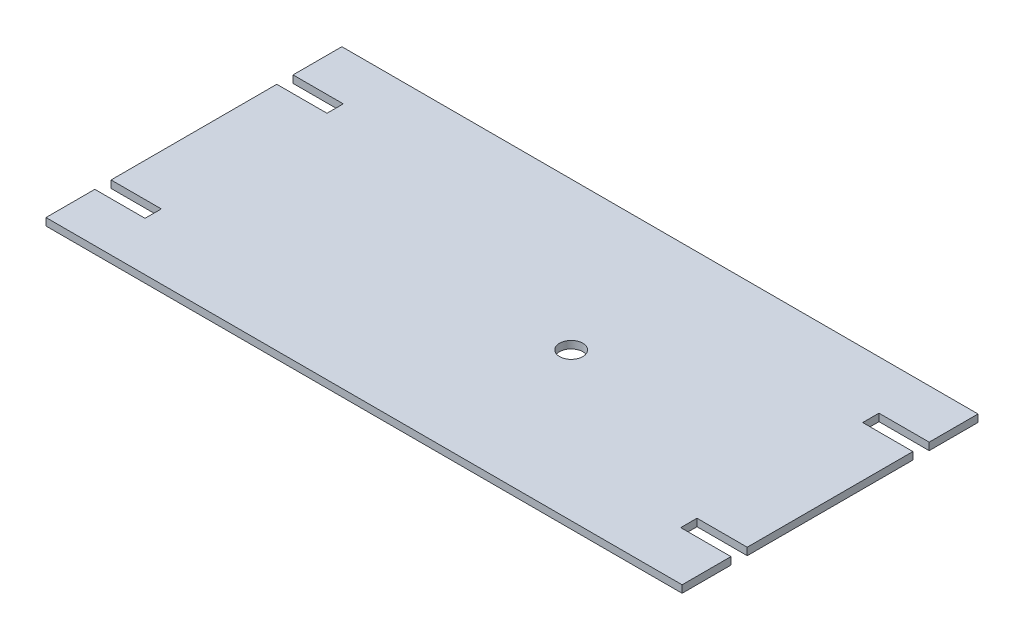
ISO-10303-21;
HEADER;
FILE_DESCRIPTION(('STEP AP214'),'2;1');
FILE_NAME('part.step','',(''),(''),'','','');
FILE_SCHEMA(('AUTOMOTIVE_DESIGN { 1 0 10303 214 1 1 1 1 }'));
ENDSEC;
DATA;
#1=APPLICATION_CONTEXT('core data for automotive mechanical design processes');
#2=APPLICATION_PROTOCOL_DEFINITION('international standard','automotive_design',2000,#1);
#3=PRODUCT_CONTEXT('',#1,'mechanical');
#4=PRODUCT('Part','Part','',(#3));
#5=PRODUCT_RELATED_PRODUCT_CATEGORY('part','',(#4));
#6=PRODUCT_DEFINITION_FORMATION('','',#4);
#7=PRODUCT_DEFINITION_CONTEXT('part definition',#1,'design');
#8=PRODUCT_DEFINITION('design','',#6,#7);
#9=PRODUCT_DEFINITION_SHAPE('','',#8);
#10=(LENGTH_UNIT() NAMED_UNIT(*) SI_UNIT(.MILLI.,.METRE.));
#11=(NAMED_UNIT(*) PLANE_ANGLE_UNIT() SI_UNIT($,.RADIAN.));
#12=(NAMED_UNIT(*) SI_UNIT($,.STERADIAN.) SOLID_ANGLE_UNIT());
#13=UNCERTAINTY_MEASURE_WITH_UNIT(LENGTH_MEASURE(1.E-05),#10,'distance_accuracy_value','');
#14=(GEOMETRIC_REPRESENTATION_CONTEXT(3) GLOBAL_UNCERTAINTY_ASSIGNED_CONTEXT((#13)) GLOBAL_UNIT_ASSIGNED_CONTEXT((#10,
#11,#12)) REPRESENTATION_CONTEXT('',''));
#15=CARTESIAN_POINT('',(0.,0.,0.));
#16=DIRECTION('',(0.,0.,1.));
#17=DIRECTION('',(1.,0.,0.));
#18=AXIS2_PLACEMENT_3D('',#15,#16,#17);
#19=CARTESIAN_POINT('',(215.,5.,0.));
#20=DIRECTION('',(-1.,0.,0.));
#21=DIRECTION('',(0.,0.,1.));
#22=AXIS2_PLACEMENT_3D('',#19,#20,#21);
#23=PLANE('',#22);
#24=DIRECTION('',(0.,0.,-1.));
#25=VECTOR('',#24,1.);
#26=CARTESIAN_POINT('',(215.,0.,0.));
#27=LINE('',#26,#25);
#28=CARTESIAN_POINT('',(215.,0.,56.0020756584231));
#29=VERTEX_POINT('',#28);
#30=CARTESIAN_POINT('',(215.,0.,-56.0020756584231));
#31=VERTEX_POINT('',#30);
#32=EDGE_CURVE('E214',#29,#31,#27,.T.);
#33=ORIENTED_EDGE('',*,*,#32,.T.);
#34=DIRECTION('',(0.,-1.,0.));
#35=VECTOR('',#34,1.);
#36=CARTESIAN_POINT('',(215.,5.,-56.0020756584231));
#37=LINE('',#36,#35);
#38=CARTESIAN_POINT('',(215.,5.,-56.0020756584231));
#39=VERTEX_POINT('',#38);
#40=EDGE_CURVE('E11',#39,#31,#37,.T.);
#41=ORIENTED_EDGE('',*,*,#40,.F.);
#42=DIRECTION('',(0.,0.,-1.));
#43=VECTOR('',#42,1.);
#44=CARTESIAN_POINT('',(215.,5.,0.));
#45=LINE('',#44,#43);
#46=CARTESIAN_POINT('',(215.,5.,56.0020756584231));
#47=VERTEX_POINT('',#46);
#48=EDGE_CURVE('E273',#47,#39,#45,.T.);
#49=ORIENTED_EDGE('',*,*,#48,.F.);
#50=DIRECTION('',(0.,-1.,0.));
#51=VECTOR('',#50,1.);
#52=CARTESIAN_POINT('',(215.,5.,56.0020756584231));
#53=LINE('',#52,#51);
#54=EDGE_CURVE('E58',#47,#29,#53,.T.);
#55=ORIENTED_EDGE('',*,*,#54,.T.);
#56=EDGE_LOOP('',(#33,#41,#49,#55));
#57=FACE_BOUND('',#56,.T.);
#58=ADVANCED_FACE('F40',(#57),#23,.F.);
#59=CARTESIAN_POINT('',(0.,5.,-56.0020756584231));
#60=DIRECTION('',(0.,0.,1.));
#61=DIRECTION('',(1.,0.,0.));
#62=AXIS2_PLACEMENT_3D('',#59,#60,#61);
#63=PLANE('',#62);
#64=DIRECTION('',(-1.,0.,0.));
#65=VECTOR('',#64,1.);
#66=CARTESIAN_POINT('',(0.,0.,-56.0020756584231));
#67=LINE('',#66,#65);
#68=CARTESIAN_POINT('',(181.053785400945,0.,-56.0020756584231));
#69=VERTEX_POINT('',#68);
#70=EDGE_CURVE('E217',#31,#69,#67,.T.);
#71=ORIENTED_EDGE('',*,*,#70,.T.);
#72=DIRECTION('',(0.,-1.,0.));
#73=VECTOR('',#72,1.);
#74=CARTESIAN_POINT('',(181.053785400945,5.,-56.0020756584231));
#75=LINE('',#74,#73);
#76=CARTESIAN_POINT('',(181.053785400945,5.,-56.0020756584231));
#77=VERTEX_POINT('',#76);
#78=EDGE_CURVE('E50',#77,#69,#75,.T.);
#79=ORIENTED_EDGE('',*,*,#78,.F.);
#80=DIRECTION('',(-1.,0.,0.));
#81=VECTOR('',#80,1.);
#82=CARTESIAN_POINT('',(0.,5.,-56.0020756584231));
#83=LINE('',#82,#81);
#84=EDGE_CURVE('E132',#39,#77,#83,.T.);
#85=ORIENTED_EDGE('',*,*,#84,.F.);
#86=ORIENTED_EDGE('',*,*,#40,.T.);
#87=EDGE_LOOP('',(#71,#79,#85,#86));
#88=FACE_BOUND('',#87,.T.);
#89=ADVANCED_FACE('F42',(#88),#63,.F.);
#90=CARTESIAN_POINT('',(181.053785400945,5.,4.56841093744707E-13));
#91=DIRECTION('',(-1.,0.,0.));
#92=DIRECTION('',(0.,0.,1.));
#93=AXIS2_PLACEMENT_3D('',#90,#91,#92);
#94=PLANE('',#93);
#95=DIRECTION('',(0.,0.,-1.));
#96=VECTOR('',#95,1.);
#97=CARTESIAN_POINT('',(181.053785400945,0.,4.56841093744707E-13));
#98=LINE('',#97,#96);
#99=CARTESIAN_POINT('',(181.053785400945,0.,-67.0020756584231));
#100=VERTEX_POINT('',#99);
#101=EDGE_CURVE('E223',#69,#100,#98,.T.);
#102=ORIENTED_EDGE('',*,*,#101,.T.);
#103=DIRECTION('',(0.,-1.,0.));
#104=VECTOR('',#103,1.);
#105=CARTESIAN_POINT('',(181.053785400945,5.,-67.0020756584231));
#106=LINE('',#105,#104);
#107=CARTESIAN_POINT('',(181.053785400945,5.,-67.0020756584231));
#108=VERTEX_POINT('',#107);
#109=EDGE_CURVE('E323',#108,#100,#106,.T.);
#110=ORIENTED_EDGE('',*,*,#109,.F.);
#111=DIRECTION('',(0.,0.,-1.));
#112=VECTOR('',#111,1.);
#113=CARTESIAN_POINT('',(181.053785400945,5.,4.56841093744707E-13));
#114=LINE('',#113,#112);
#115=EDGE_CURVE('E333',#77,#108,#114,.T.);
#116=ORIENTED_EDGE('',*,*,#115,.F.);
#117=ORIENTED_EDGE('',*,*,#78,.T.);
#118=EDGE_LOOP('',(#102,#110,#116,#117));
#119=FACE_BOUND('',#118,.T.);
#120=ADVANCED_FACE('F331',(#119),#94,.F.);
#121=CARTESIAN_POINT('',(0.,5.,-67.0020756584232));
#122=DIRECTION('',(0.,0.,-1.));
#123=DIRECTION('',(-1.,0.,0.));
#124=AXIS2_PLACEMENT_3D('',#121,#122,#123);
#125=PLANE('',#124);
#126=DIRECTION('',(1.,0.,0.));
#127=VECTOR('',#126,1.);
#128=CARTESIAN_POINT('',(0.,0.,-67.0020756584232));
#129=LINE('',#128,#127);
#130=CARTESIAN_POINT('',(215.,0.,-67.0020756584231));
#131=VERTEX_POINT('',#130);
#132=EDGE_CURVE('E226',#100,#131,#129,.T.);
#133=ORIENTED_EDGE('',*,*,#132,.T.);
#134=DIRECTION('',(0.,-1.,0.));
#135=VECTOR('',#134,1.);
#136=CARTESIAN_POINT('',(215.,5.,-67.0020756584231));
#137=LINE('',#136,#135);
#138=CARTESIAN_POINT('',(215.,5.,-67.0020756584231));
#139=VERTEX_POINT('',#138);
#140=EDGE_CURVE('E319',#139,#131,#137,.T.);
#141=ORIENTED_EDGE('',*,*,#140,.F.);
#142=DIRECTION('',(1.,0.,0.));
#143=VECTOR('',#142,1.);
#144=CARTESIAN_POINT('',(0.,5.,-67.0020756584232));
#145=LINE('',#144,#143);
#146=EDGE_CURVE('E352',#108,#139,#145,.T.);
#147=ORIENTED_EDGE('',*,*,#146,.F.);
#148=ORIENTED_EDGE('',*,*,#109,.T.);
#149=EDGE_LOOP('',(#133,#141,#147,#148));
#150=FACE_BOUND('',#149,.T.);
#151=ADVANCED_FACE('F341',(#150),#125,.F.);
#152=CARTESIAN_POINT('',(215.,0.,-100.));
#153=VERTEX_POINT('',#152);
#154=EDGE_CURVE('E220',#131,#153,#27,.T.);
#155=ORIENTED_EDGE('',*,*,#154,.T.);
#156=DIRECTION('',(0.,-1.,0.));
#157=VECTOR('',#156,1.);
#158=CARTESIAN_POINT('',(215.,5.,-100.));
#159=LINE('',#158,#157);
#160=CARTESIAN_POINT('',(215.,5.,-100.));
#161=VERTEX_POINT('',#160);
#162=EDGE_CURVE('E316',#161,#153,#159,.T.);
#163=ORIENTED_EDGE('',*,*,#162,.F.);
#164=EDGE_CURVE('E347',#139,#161,#45,.T.);
#165=ORIENTED_EDGE('',*,*,#164,.F.);
#166=ORIENTED_EDGE('',*,*,#140,.T.);
#167=EDGE_LOOP('',(#155,#163,#165,#166));
#168=FACE_BOUND('',#167,.T.);
#169=ADVANCED_FACE('F345',(#168),#23,.F.);
#170=CARTESIAN_POINT('',(0.,5.,-100.));
#171=DIRECTION('',(0.,0.,-1.));
#172=DIRECTION('',(-1.,0.,0.));
#173=AXIS2_PLACEMENT_3D('',#170,#171,#172);
#174=PLANE('',#173);
#175=DIRECTION('',(1.,0.,0.));
#176=VECTOR('',#175,1.);
#177=CARTESIAN_POINT('',(0.,0.,-100.));
#178=LINE('',#177,#176);
#179=CARTESIAN_POINT('',(-215.,0.,-100.));
#180=VERTEX_POINT('',#179);
#181=EDGE_CURVE('E229',#180,#153,#178,.T.);
#182=ORIENTED_EDGE('',*,*,#181,.F.);
#183=DIRECTION('',(0.,-1.,0.));
#184=VECTOR('',#183,1.);
#185=CARTESIAN_POINT('',(-215.,5.,-100.));
#186=LINE('',#185,#184);
#187=CARTESIAN_POINT('',(-215.,5.,-100.));
#188=VERTEX_POINT('',#187);
#189=EDGE_CURVE('E313',#188,#180,#186,.T.);
#190=ORIENTED_EDGE('',*,*,#189,.F.);
#191=DIRECTION('',(1.,0.,0.));
#192=VECTOR('',#191,1.);
#193=CARTESIAN_POINT('',(0.,5.,-100.));
#194=LINE('',#193,#192);
#195=EDGE_CURVE('E351',#188,#161,#194,.T.);
#196=ORIENTED_EDGE('',*,*,#195,.T.);
#197=ORIENTED_EDGE('',*,*,#162,.T.);
#198=EDGE_LOOP('',(#182,#190,#196,#197));
#199=FACE_BOUND('',#198,.T.);
#200=ADVANCED_FACE('F412',(#199),#174,.T.);
#201=CARTESIAN_POINT('',(-215.,5.,0.));
#202=DIRECTION('',(-1.,0.,0.));
#203=DIRECTION('',(0.,0.,1.));
#204=AXIS2_PLACEMENT_3D('',#201,#202,#203);
#205=PLANE('',#204);
#206=DIRECTION('',(0.,0.,-1.));
#207=VECTOR('',#206,1.);
#208=CARTESIAN_POINT('',(-215.,0.,0.));
#209=LINE('',#208,#207);
#210=CARTESIAN_POINT('',(-215.,0.,-67.0020756584231));
#211=VERTEX_POINT('',#210);
#212=EDGE_CURVE('E233',#211,#180,#209,.T.);
#213=ORIENTED_EDGE('',*,*,#212,.F.);
#214=DIRECTION('',(0.,-1.,0.));
#215=VECTOR('',#214,1.);
#216=CARTESIAN_POINT('',(-215.,5.,-67.0020756584231));
#217=LINE('',#216,#215);
#218=CARTESIAN_POINT('',(-215.,5.,-67.0020756584231));
#219=VERTEX_POINT('',#218);
#220=EDGE_CURVE('E310',#219,#211,#217,.T.);
#221=ORIENTED_EDGE('',*,*,#220,.F.);
#222=DIRECTION('',(0.,0.,-1.));
#223=VECTOR('',#222,1.);
#224=CARTESIAN_POINT('',(-215.,5.,0.));
#225=LINE('',#224,#223);
#226=EDGE_CURVE('E356',#219,#188,#225,.T.);
#227=ORIENTED_EDGE('',*,*,#226,.T.);
#228=ORIENTED_EDGE('',*,*,#189,.T.);
#229=EDGE_LOOP('',(#213,#221,#227,#228));
#230=FACE_BOUND('',#229,.T.);
#231=ADVANCED_FACE('F497',(#230),#205,.T.);
#232=CARTESIAN_POINT('',(0.,5.,-67.0020756584232));
#233=DIRECTION('',(0.,0.,1.));
#234=DIRECTION('',(1.,0.,0.));
#235=AXIS2_PLACEMENT_3D('',#232,#233,#234);
#236=PLANE('',#235);
#237=DIRECTION('',(-1.,0.,0.));
#238=VECTOR('',#237,1.);
#239=CARTESIAN_POINT('',(0.,0.,-67.0020756584232));
#240=LINE('',#239,#238);
#241=CARTESIAN_POINT('',(-181.053785400945,0.,-67.0020756584231));
#242=VERTEX_POINT('',#241);
#243=EDGE_CURVE('E237',#242,#211,#240,.T.);
#244=ORIENTED_EDGE('',*,*,#243,.F.);
#245=DIRECTION('',(0.,-1.,0.));
#246=VECTOR('',#245,1.);
#247=CARTESIAN_POINT('',(-181.053785400945,5.,-67.0020756584231));
#248=LINE('',#247,#246);
#249=CARTESIAN_POINT('',(-181.053785400945,5.,-67.0020756584231));
#250=VERTEX_POINT('',#249);
#251=EDGE_CURVE('E307',#250,#242,#248,.T.);
#252=ORIENTED_EDGE('',*,*,#251,.F.);
#253=DIRECTION('',(-1.,0.,0.));
#254=VECTOR('',#253,1.);
#255=CARTESIAN_POINT('',(0.,5.,-67.0020756584232));
#256=LINE('',#255,#254);
#257=EDGE_CURVE('E391',#250,#219,#256,.T.);
#258=ORIENTED_EDGE('',*,*,#257,.T.);
#259=ORIENTED_EDGE('',*,*,#220,.T.);
#260=EDGE_LOOP('',(#244,#252,#258,#259));
#261=FACE_BOUND('',#260,.T.);
#262=ADVANCED_FACE('F493',(#261),#236,.T.);
#263=CARTESIAN_POINT('',(-181.053785400945,5.,4.56841093744707E-13));
#264=DIRECTION('',(-1.,0.,0.));
#265=DIRECTION('',(0.,0.,1.));
#266=AXIS2_PLACEMENT_3D('',#263,#264,#265);
#267=PLANE('',#266);
#268=DIRECTION('',(0.,0.,-1.));
#269=VECTOR('',#268,1.);
#270=CARTESIAN_POINT('',(-181.053785400945,0.,4.56841093744707E-13));
#271=LINE('',#270,#269);
#272=CARTESIAN_POINT('',(-181.053785400945,0.,-56.0020756584231));
#273=VERTEX_POINT('',#272);
#274=EDGE_CURVE('E243',#273,#242,#271,.T.);
#275=ORIENTED_EDGE('',*,*,#274,.F.);
#276=DIRECTION('',(0.,-1.,0.));
#277=VECTOR('',#276,1.);
#278=CARTESIAN_POINT('',(-181.053785400945,5.,-56.0020756584231));
#279=LINE('',#278,#277);
#280=CARTESIAN_POINT('',(-181.053785400945,5.,-56.0020756584231));
#281=VERTEX_POINT('',#280);
#282=EDGE_CURVE('E304',#281,#273,#279,.T.);
#283=ORIENTED_EDGE('',*,*,#282,.F.);
#284=DIRECTION('',(0.,0.,-1.));
#285=VECTOR('',#284,1.);
#286=CARTESIAN_POINT('',(-181.053785400945,5.,4.56841093744707E-13));
#287=LINE('',#286,#285);
#288=EDGE_CURVE('E387',#281,#250,#287,.T.);
#289=ORIENTED_EDGE('',*,*,#288,.T.);
#290=ORIENTED_EDGE('',*,*,#251,.T.);
#291=EDGE_LOOP('',(#275,#283,#289,#290));
#292=FACE_BOUND('',#291,.T.);
#293=ADVANCED_FACE('F489',(#292),#267,.T.);
#294=CARTESIAN_POINT('',(0.,5.,-56.0020756584231));
#295=DIRECTION('',(0.,0.,-1.));
#296=DIRECTION('',(-1.,0.,0.));
#297=AXIS2_PLACEMENT_3D('',#294,#295,#296);
#298=PLANE('',#297);
#299=DIRECTION('',(1.,0.,0.));
#300=VECTOR('',#299,1.);
#301=CARTESIAN_POINT('',(0.,0.,-56.0020756584231));
#302=LINE('',#301,#300);
#303=CARTESIAN_POINT('',(-215.,0.,-56.0020756584231));
#304=VERTEX_POINT('',#303);
#305=EDGE_CURVE('E247',#304,#273,#302,.T.);
#306=ORIENTED_EDGE('',*,*,#305,.F.);
#307=DIRECTION('',(0.,-1.,0.));
#308=VECTOR('',#307,1.);
#309=CARTESIAN_POINT('',(-215.,5.,-56.0020756584231));
#310=LINE('',#309,#308);
#311=CARTESIAN_POINT('',(-215.,5.,-56.0020756584231));
#312=VERTEX_POINT('',#311);
#313=EDGE_CURVE('E301',#312,#304,#310,.T.);
#314=ORIENTED_EDGE('',*,*,#313,.F.);
#315=DIRECTION('',(1.,0.,0.));
#316=VECTOR('',#315,1.);
#317=CARTESIAN_POINT('',(0.,5.,-56.0020756584231));
#318=LINE('',#317,#316);
#319=EDGE_CURVE('E383',#312,#281,#318,.T.);
#320=ORIENTED_EDGE('',*,*,#319,.T.);
#321=ORIENTED_EDGE('',*,*,#282,.T.);
#322=EDGE_LOOP('',(#306,#314,#320,#321));
#323=FACE_BOUND('',#322,.T.);
#324=ADVANCED_FACE('F485',(#323),#298,.T.);
#325=CARTESIAN_POINT('',(-215.,0.,56.0020756584231));
#326=VERTEX_POINT('',#325);
#327=EDGE_CURVE('E239',#326,#304,#209,.T.);
#328=ORIENTED_EDGE('',*,*,#327,.F.);
#329=DIRECTION('',(0.,-1.,0.));
#330=VECTOR('',#329,1.);
#331=CARTESIAN_POINT('',(-215.,5.,56.0020756584231));
#332=LINE('',#331,#330);
#333=CARTESIAN_POINT('',(-215.,5.,56.0020756584231));
#334=VERTEX_POINT('',#333);
#335=EDGE_CURVE('E298',#334,#326,#332,.T.);
#336=ORIENTED_EDGE('',*,*,#335,.F.);
#337=EDGE_CURVE('E373',#334,#312,#225,.T.);
#338=ORIENTED_EDGE('',*,*,#337,.T.);
#339=ORIENTED_EDGE('',*,*,#313,.T.);
#340=EDGE_LOOP('',(#328,#336,#338,#339));
#341=FACE_BOUND('',#340,.T.);
#342=ADVANCED_FACE('F478',(#341),#205,.T.);
#343=CARTESIAN_POINT('',(0.,5.,56.0020756584231));
#344=DIRECTION('',(0.,0.,-1.));
#345=DIRECTION('',(-1.,0.,0.));
#346=AXIS2_PLACEMENT_3D('',#343,#344,#345);
#347=PLANE('',#346);
#348=DIRECTION('',(1.,0.,0.));
#349=VECTOR('',#348,1.);
#350=CARTESIAN_POINT('',(0.,0.,56.0020756584231));
#351=LINE('',#350,#349);
#352=CARTESIAN_POINT('',(-181.053785400945,0.,56.0020756584231));
#353=VERTEX_POINT('',#352);
#354=EDGE_CURVE('E251',#326,#353,#351,.T.);
#355=ORIENTED_EDGE('',*,*,#354,.T.);
#356=DIRECTION('',(0.,-1.,0.));
#357=VECTOR('',#356,1.);
#358=CARTESIAN_POINT('',(-181.053785400945,5.,56.0020756584231));
#359=LINE('',#358,#357);
#360=CARTESIAN_POINT('',(-181.053785400945,5.,56.0020756584231));
#361=VERTEX_POINT('',#360);
#362=EDGE_CURVE('E294',#361,#353,#359,.T.);
#363=ORIENTED_EDGE('',*,*,#362,.F.);
#364=DIRECTION('',(1.,0.,0.));
#365=VECTOR('',#364,1.);
#366=CARTESIAN_POINT('',(0.,5.,56.0020756584231));
#367=LINE('',#366,#365);
#368=EDGE_CURVE('E380',#334,#361,#367,.T.);
#369=ORIENTED_EDGE('',*,*,#368,.F.);
#370=ORIENTED_EDGE('',*,*,#335,.T.);
#371=EDGE_LOOP('',(#355,#363,#369,#370));
#372=FACE_BOUND('',#371,.T.);
#373=ADVANCED_FACE('F501',(#372),#347,.F.);
#374=CARTESIAN_POINT('',(-181.053785400945,5.,0.));
#375=DIRECTION('',(1.,0.,0.));
#376=DIRECTION('',(0.,0.,-1.));
#377=AXIS2_PLACEMENT_3D('',#374,#375,#376);
#378=PLANE('',#377);
#379=DIRECTION('',(0.,0.,1.));
#380=VECTOR('',#379,1.);
#381=CARTESIAN_POINT('',(-181.053785400945,0.,0.));
#382=LINE('',#381,#380);
#383=CARTESIAN_POINT('',(-181.053785400945,0.,67.0020756584231));
#384=VERTEX_POINT('',#383);
#385=EDGE_CURVE('E254',#353,#384,#382,.T.);
#386=ORIENTED_EDGE('',*,*,#385,.T.);
#387=DIRECTION('',(0.,-1.,0.));
#388=VECTOR('',#387,1.);
#389=CARTESIAN_POINT('',(-181.053785400945,5.,67.0020756584231));
#390=LINE('',#389,#388);
#391=CARTESIAN_POINT('',(-181.053785400945,5.,67.0020756584231));
#392=VERTEX_POINT('',#391);
#393=EDGE_CURVE('E290',#392,#384,#390,.T.);
#394=ORIENTED_EDGE('',*,*,#393,.F.);
#395=DIRECTION('',(0.,0.,1.));
#396=VECTOR('',#395,1.);
#397=CARTESIAN_POINT('',(-181.053785400945,5.,0.));
#398=LINE('',#397,#396);
#399=EDGE_CURVE('E377',#361,#392,#398,.T.);
#400=ORIENTED_EDGE('',*,*,#399,.F.);
#401=ORIENTED_EDGE('',*,*,#362,.T.);
#402=EDGE_LOOP('',(#386,#394,#400,#401));
#403=FACE_BOUND('',#402,.T.);
#404=ADVANCED_FACE('F472',(#403),#378,.F.);
#405=CARTESIAN_POINT('',(0.,5.,67.0020756584231));
#406=DIRECTION('',(0.,0.,1.));
#407=DIRECTION('',(1.,0.,0.));
#408=AXIS2_PLACEMENT_3D('',#405,#406,#407);
#409=PLANE('',#408);
#410=DIRECTION('',(-1.,0.,0.));
#411=VECTOR('',#410,1.);
#412=CARTESIAN_POINT('',(0.,0.,67.0020756584231));
#413=LINE('',#412,#411);
#414=CARTESIAN_POINT('',(-215.,0.,67.0020756584231));
#415=VERTEX_POINT('',#414);
#416=EDGE_CURVE('E257',#384,#415,#413,.T.);
#417=ORIENTED_EDGE('',*,*,#416,.T.);
#418=DIRECTION('',(0.,-1.,0.));
#419=VECTOR('',#418,1.);
#420=CARTESIAN_POINT('',(-215.,5.,67.0020756584231));
#421=LINE('',#420,#419);
#422=CARTESIAN_POINT('',(-215.,5.,67.0020756584231));
#423=VERTEX_POINT('',#422);
#424=EDGE_CURVE('E287',#423,#415,#421,.T.);
#425=ORIENTED_EDGE('',*,*,#424,.F.);
#426=DIRECTION('',(-1.,0.,0.));
#427=VECTOR('',#426,1.);
#428=CARTESIAN_POINT('',(0.,5.,67.0020756584231));
#429=LINE('',#428,#427);
#430=EDGE_CURVE('E371',#392,#423,#429,.T.);
#431=ORIENTED_EDGE('',*,*,#430,.F.);
#432=ORIENTED_EDGE('',*,*,#393,.T.);
#433=EDGE_LOOP('',(#417,#425,#431,#432));
#434=FACE_BOUND('',#433,.T.);
#435=ADVANCED_FACE('F468',(#434),#409,.F.);
#436=CARTESIAN_POINT('',(-215.,0.,100.));
#437=VERTEX_POINT('',#436);
#438=EDGE_CURVE('E238',#437,#415,#209,.T.);
#439=ORIENTED_EDGE('',*,*,#438,.F.);
#440=DIRECTION('',(0.,-1.,0.));
#441=VECTOR('',#440,1.);
#442=CARTESIAN_POINT('',(-215.,5.,100.));
#443=LINE('',#442,#441);
#444=CARTESIAN_POINT('',(-215.,5.,100.));
#445=VERTEX_POINT('',#444);
#446=EDGE_CURVE('E284',#445,#437,#443,.T.);
#447=ORIENTED_EDGE('',*,*,#446,.F.);
#448=EDGE_CURVE('E365',#445,#423,#225,.T.);
#449=ORIENTED_EDGE('',*,*,#448,.T.);
#450=ORIENTED_EDGE('',*,*,#424,.T.);
#451=EDGE_LOOP('',(#439,#447,#449,#450));
#452=FACE_BOUND('',#451,.T.);
#453=ADVANCED_FACE('F420',(#452),#205,.T.);
#454=CARTESIAN_POINT('',(0.,5.,100.));
#455=DIRECTION('',(0.,0.,-1.));
#456=DIRECTION('',(-1.,0.,0.));
#457=AXIS2_PLACEMENT_3D('',#454,#455,#456);
#458=PLANE('',#457);
#459=DIRECTION('',(1.,0.,0.));
#460=VECTOR('',#459,1.);
#461=CARTESIAN_POINT('',(0.,0.,100.));
#462=LINE('',#461,#460);
#463=CARTESIAN_POINT('',(215.,0.,100.));
#464=VERTEX_POINT('',#463);
#465=EDGE_CURVE('E261',#437,#464,#462,.T.);
#466=ORIENTED_EDGE('',*,*,#465,.T.);
#467=DIRECTION('',(0.,-1.,0.));
#468=VECTOR('',#467,1.);
#469=CARTESIAN_POINT('',(215.,5.,100.));
#470=LINE('',#469,#468);
#471=CARTESIAN_POINT('',(215.,5.,100.));
#472=VERTEX_POINT('',#471);
#473=EDGE_CURVE('E280',#472,#464,#470,.T.);
#474=ORIENTED_EDGE('',*,*,#473,.F.);
#475=DIRECTION('',(1.,0.,0.));
#476=VECTOR('',#475,1.);
#477=CARTESIAN_POINT('',(0.,5.,100.));
#478=LINE('',#477,#476);
#479=EDGE_CURVE('E363',#445,#472,#478,.T.);
#480=ORIENTED_EDGE('',*,*,#479,.F.);
#481=ORIENTED_EDGE('',*,*,#446,.T.);
#482=EDGE_LOOP('',(#466,#474,#480,#481));
#483=FACE_BOUND('',#482,.T.);
#484=ADVANCED_FACE('F414',(#483),#458,.F.);
#485=CARTESIAN_POINT('',(215.,0.,67.0020756584231));
#486=VERTEX_POINT('',#485);
#487=EDGE_CURVE('E219',#464,#486,#27,.T.);
#488=ORIENTED_EDGE('',*,*,#487,.T.);
#489=DIRECTION('',(0.,-1.,0.));
#490=VECTOR('',#489,1.);
#491=CARTESIAN_POINT('',(215.,5.,67.0020756584231));
#492=LINE('',#491,#490);
#493=CARTESIAN_POINT('',(215.,5.,67.0020756584231));
#494=VERTEX_POINT('',#493);
#495=EDGE_CURVE('E194',#494,#486,#492,.T.);
#496=ORIENTED_EDGE('',*,*,#495,.F.);
#497=EDGE_CURVE('E202',#472,#494,#45,.T.);
#498=ORIENTED_EDGE('',*,*,#497,.F.);
#499=ORIENTED_EDGE('',*,*,#473,.T.);
#500=EDGE_LOOP('',(#488,#496,#498,#499));
#501=FACE_BOUND('',#500,.T.);
#502=ADVANCED_FACE('F406',(#501),#23,.F.);
#503=CARTESIAN_POINT('',(0.,5.,67.0020756584231));
#504=DIRECTION('',(0.,0.,-1.));
#505=DIRECTION('',(-1.,0.,0.));
#506=AXIS2_PLACEMENT_3D('',#503,#504,#505);
#507=PLANE('',#506);
#508=DIRECTION('',(1.,0.,0.));
#509=VECTOR('',#508,1.);
#510=CARTESIAN_POINT('',(0.,0.,67.0020756584231));
#511=LINE('',#510,#509);
#512=CARTESIAN_POINT('',(181.053785400945,0.,67.0020756584231));
#513=VERTEX_POINT('',#512);
#514=EDGE_CURVE('E189',#513,#486,#511,.T.);
#515=ORIENTED_EDGE('',*,*,#514,.F.);
#516=DIRECTION('',(0.,-1.,0.));
#517=VECTOR('',#516,1.);
#518=CARTESIAN_POINT('',(181.053785400945,5.,67.0020756584231));
#519=LINE('',#518,#517);
#520=CARTESIAN_POINT('',(181.053785400945,5.,67.0020756584231));
#521=VERTEX_POINT('',#520);
#522=EDGE_CURVE('E184',#521,#513,#519,.T.);
#523=ORIENTED_EDGE('',*,*,#522,.F.);
#524=DIRECTION('',(1.,0.,0.));
#525=VECTOR('',#524,1.);
#526=CARTESIAN_POINT('',(0.,5.,67.0020756584231));
#527=LINE('',#526,#525);
#528=EDGE_CURVE('E187',#521,#494,#527,.T.);
#529=ORIENTED_EDGE('',*,*,#528,.T.);
#530=ORIENTED_EDGE('',*,*,#495,.T.);
#531=EDGE_LOOP('',(#515,#523,#529,#530));
#532=FACE_BOUND('',#531,.T.);
#533=ADVANCED_FACE('F186',(#532),#507,.T.);
#534=CARTESIAN_POINT('',(181.053785400945,5.,0.));
#535=DIRECTION('',(1.,0.,0.));
#536=DIRECTION('',(0.,0.,-1.));
#537=AXIS2_PLACEMENT_3D('',#534,#535,#536);
#538=PLANE('',#537);
#539=DIRECTION('',(0.,0.,1.));
#540=VECTOR('',#539,1.);
#541=CARTESIAN_POINT('',(181.053785400945,0.,0.));
#542=LINE('',#541,#540);
#543=CARTESIAN_POINT('',(181.053785400945,0.,56.0020756584231));
#544=VERTEX_POINT('',#543);
#545=EDGE_CURVE('E266',#544,#513,#542,.T.);
#546=ORIENTED_EDGE('',*,*,#545,.F.);
#547=DIRECTION('',(0.,-1.,0.));
#548=VECTOR('',#547,1.);
#549=CARTESIAN_POINT('',(181.053785400945,5.,56.0020756584231));
#550=LINE('',#549,#548);
#551=CARTESIAN_POINT('',(181.053785400945,5.,56.0020756584231));
#552=VERTEX_POINT('',#551);
#553=EDGE_CURVE('E120',#552,#544,#550,.T.);
#554=ORIENTED_EDGE('',*,*,#553,.F.);
#555=DIRECTION('',(0.,0.,1.));
#556=VECTOR('',#555,1.);
#557=CARTESIAN_POINT('',(181.053785400945,5.,0.));
#558=LINE('',#557,#556);
#559=EDGE_CURVE('E200',#552,#521,#558,.T.);
#560=ORIENTED_EDGE('',*,*,#559,.T.);
#561=ORIENTED_EDGE('',*,*,#522,.T.);
#562=EDGE_LOOP('',(#546,#554,#560,#561));
#563=FACE_BOUND('',#562,.T.);
#564=ADVANCED_FACE('F206',(#563),#538,.T.);
#565=CARTESIAN_POINT('',(0.,5.,56.0020756584231));
#566=DIRECTION('',(0.,0.,1.));
#567=DIRECTION('',(1.,0.,0.));
#568=AXIS2_PLACEMENT_3D('',#565,#566,#567);
#569=PLANE('',#568);
#570=DIRECTION('',(-1.,0.,0.));
#571=VECTOR('',#570,1.);
#572=CARTESIAN_POINT('',(0.,0.,56.0020756584231));
#573=LINE('',#572,#571);
#574=EDGE_CURVE('E269',#29,#544,#573,.T.);
#575=ORIENTED_EDGE('',*,*,#574,.F.);
#576=ORIENTED_EDGE('',*,*,#54,.F.);
#577=DIRECTION('',(-1.,0.,0.));
#578=VECTOR('',#577,1.);
#579=CARTESIAN_POINT('',(0.,5.,56.0020756584231));
#580=LINE('',#579,#578);
#581=EDGE_CURVE('E208',#47,#552,#580,.T.);
#582=ORIENTED_EDGE('',*,*,#581,.T.);
#583=ORIENTED_EDGE('',*,*,#553,.T.);
#584=EDGE_LOOP('',(#575,#576,#582,#583));
#585=FACE_BOUND('',#584,.T.);
#586=ADVANCED_FACE('F426',(#585),#569,.T.);
#587=CARTESIAN_POINT('',(0.,5.,0.));
#588=DIRECTION('',(0.,1.,0.));
#589=DIRECTION('',(0.,0.,1.));
#590=AXIS2_PLACEMENT_3D('',#587,#588,#589);
#591=PLANE('',#590);
#592=CARTESIAN_POINT('',(40.,5.,0.));
#593=DIRECTION('',(0.,1.,0.));
#594=DIRECTION('',(0.,0.,1.));
#595=AXIS2_PLACEMENT_3D('',#592,#593,#594);
#596=CIRCLE('',#595,7.84999999999999);
#597=CARTESIAN_POINT('',(40.,5.,7.84999999999998));
#598=VERTEX_POINT('',#597);
#599=EDGE_CURVE('E452',#598,#598,#596,.T.);
#600=ORIENTED_EDGE('',*,*,#599,.F.);
#601=EDGE_LOOP('',(#600));
#602=FACE_BOUND('',#601,.T.);
#603=ORIENTED_EDGE('',*,*,#48,.T.);
#604=ORIENTED_EDGE('',*,*,#84,.T.);
#605=ORIENTED_EDGE('',*,*,#115,.T.);
#606=ORIENTED_EDGE('',*,*,#146,.T.);
#607=ORIENTED_EDGE('',*,*,#164,.T.);
#608=ORIENTED_EDGE('',*,*,#195,.F.);
#609=ORIENTED_EDGE('',*,*,#226,.F.);
#610=ORIENTED_EDGE('',*,*,#257,.F.);
#611=ORIENTED_EDGE('',*,*,#288,.F.);
#612=ORIENTED_EDGE('',*,*,#319,.F.);
#613=ORIENTED_EDGE('',*,*,#337,.F.);
#614=ORIENTED_EDGE('',*,*,#368,.T.);
#615=ORIENTED_EDGE('',*,*,#399,.T.);
#616=ORIENTED_EDGE('',*,*,#430,.T.);
#617=ORIENTED_EDGE('',*,*,#448,.F.);
#618=ORIENTED_EDGE('',*,*,#479,.T.);
#619=ORIENTED_EDGE('',*,*,#497,.T.);
#620=ORIENTED_EDGE('',*,*,#528,.F.);
#621=ORIENTED_EDGE('',*,*,#559,.F.);
#622=ORIENTED_EDGE('',*,*,#581,.F.);
#623=EDGE_LOOP('',(#603,#604,#605,#606,#607,#608,#609,#610,#611,#612,#613,#614,#615,#616,#617,
#618,#619,#620,#621,#622));
#624=FACE_BOUND('',#623,.T.);
#625=ADVANCED_FACE('F198',(#602,#624),#591,.T.);
#626=CARTESIAN_POINT('',(0.,0.,0.));
#627=DIRECTION('',(0.,1.,0.));
#628=DIRECTION('',(0.,0.,1.));
#629=AXIS2_PLACEMENT_3D('',#626,#627,#628);
#630=PLANE('',#629);
#631=CARTESIAN_POINT('',(40.,0.,0.));
#632=DIRECTION('',(0.,1.,0.));
#633=DIRECTION('',(0.,0.,1.));
#634=AXIS2_PLACEMENT_3D('',#631,#632,#633);
#635=CIRCLE('',#634,7.84999999999999);
#636=CARTESIAN_POINT('',(40.,0.,7.84999999999998));
#637=VERTEX_POINT('',#636);
#638=EDGE_CURVE('E218',#637,#637,#635,.T.);
#639=ORIENTED_EDGE('',*,*,#638,.T.);
#640=EDGE_LOOP('',(#639));
#641=FACE_BOUND('',#640,.T.);
#642=ORIENTED_EDGE('',*,*,#32,.F.);
#643=ORIENTED_EDGE('',*,*,#574,.T.);
#644=ORIENTED_EDGE('',*,*,#545,.T.);
#645=ORIENTED_EDGE('',*,*,#514,.T.);
#646=ORIENTED_EDGE('',*,*,#487,.F.);
#647=ORIENTED_EDGE('',*,*,#465,.F.);
#648=ORIENTED_EDGE('',*,*,#438,.T.);
#649=ORIENTED_EDGE('',*,*,#416,.F.);
#650=ORIENTED_EDGE('',*,*,#385,.F.);
#651=ORIENTED_EDGE('',*,*,#354,.F.);
#652=ORIENTED_EDGE('',*,*,#327,.T.);
#653=ORIENTED_EDGE('',*,*,#305,.T.);
#654=ORIENTED_EDGE('',*,*,#274,.T.);
#655=ORIENTED_EDGE('',*,*,#243,.T.);
#656=ORIENTED_EDGE('',*,*,#212,.T.);
#657=ORIENTED_EDGE('',*,*,#181,.T.);
#658=ORIENTED_EDGE('',*,*,#154,.F.);
#659=ORIENTED_EDGE('',*,*,#132,.F.);
#660=ORIENTED_EDGE('',*,*,#101,.F.);
#661=ORIENTED_EDGE('',*,*,#70,.F.);
#662=EDGE_LOOP('',(#642,#643,#644,#645,#646,#647,#648,#649,#650,#651,#652,#653,#654,#655,#656,
#657,#658,#659,#660,#661));
#663=FACE_BOUND('',#662,.T.);
#664=ADVANCED_FACE('F336',(#641,#663),#630,.F.);
#665=CARTESIAN_POINT('',(40.,0.,0.));
#666=DIRECTION('',(0.,1.,0.));
#667=DIRECTION('',(0.,0.,1.));
#668=AXIS2_PLACEMENT_3D('',#665,#666,#667);
#669=CYLINDRICAL_SURFACE('',#668,7.84999999999999);
#670=ORIENTED_EDGE('',*,*,#638,.F.);
#671=EDGE_LOOP('',(#670));
#672=FACE_BOUND('',#671,.T.);
#673=ORIENTED_EDGE('',*,*,#599,.T.);
#674=EDGE_LOOP('',(#673));
#675=FACE_BOUND('',#674,.T.);
#676=ADVANCED_FACE('F439',(#672,#675),#669,.F.);
#677=CLOSED_SHELL('',(#58,#89,#120,#151,#169,#200,#231,#262,#293,#324,#342,#373,#404,#435,#453,
#484,#502,#533,#564,#586,#625,#664,#676));
#678=MANIFOLD_SOLID_BREP('B2',#677);
#679=ADVANCED_BREP_SHAPE_REPRESENTATION('',(#18,#678),#14);
#680=SHAPE_DEFINITION_REPRESENTATION(#9,#679);
ENDSEC;
END-ISO-10303-21;
